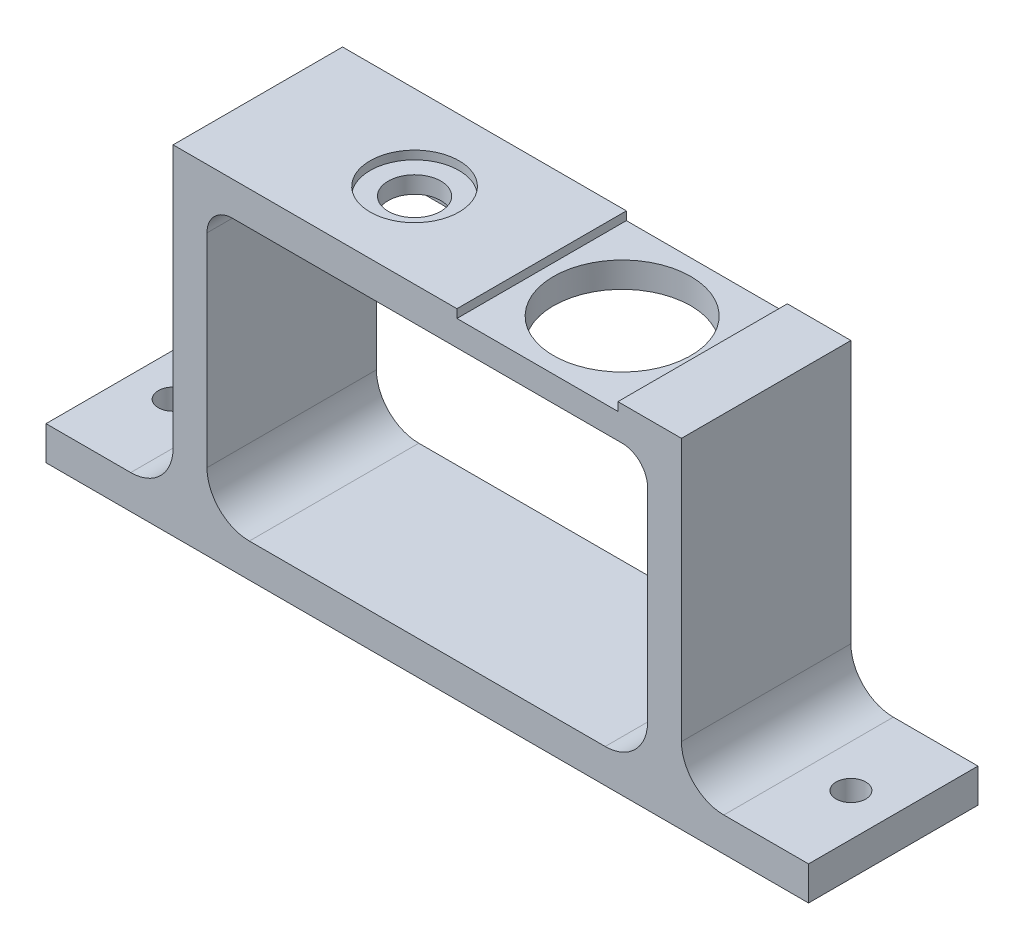
ISO-10303-21;
HEADER;
FILE_DESCRIPTION(('STEP AP214'),'2;1');
FILE_NAME('part.step','',(''),(''),'','','');
FILE_SCHEMA(('AUTOMOTIVE_DESIGN { 1 0 10303 214 1 1 1 1 }'));
ENDSEC;
DATA;
#1=APPLICATION_CONTEXT('core data for automotive mechanical design processes');
#2=APPLICATION_PROTOCOL_DEFINITION('international standard','automotive_design',2000,#1);
#3=PRODUCT_CONTEXT('',#1,'mechanical');
#4=PRODUCT('Part','Part','',(#3));
#5=PRODUCT_RELATED_PRODUCT_CATEGORY('part','',(#4));
#6=PRODUCT_DEFINITION_FORMATION('','',#4);
#7=PRODUCT_DEFINITION_CONTEXT('part definition',#1,'design');
#8=PRODUCT_DEFINITION('design','',#6,#7);
#9=PRODUCT_DEFINITION_SHAPE('','',#8);
#10=(LENGTH_UNIT() NAMED_UNIT(*) SI_UNIT(.MILLI.,.METRE.));
#11=(NAMED_UNIT(*) PLANE_ANGLE_UNIT() SI_UNIT($,.RADIAN.));
#12=(NAMED_UNIT(*) SI_UNIT($,.STERADIAN.) SOLID_ANGLE_UNIT());
#13=UNCERTAINTY_MEASURE_WITH_UNIT(LENGTH_MEASURE(1.E-05),#10,'distance_accuracy_value','');
#14=(GEOMETRIC_REPRESENTATION_CONTEXT(3) GLOBAL_UNCERTAINTY_ASSIGNED_CONTEXT((#13)) GLOBAL_UNIT_ASSIGNED_CONTEXT((#10,
#11,#12)) REPRESENTATION_CONTEXT('',''));
#15=CARTESIAN_POINT('',(0.,0.,0.));
#16=DIRECTION('',(0.,0.,1.));
#17=DIRECTION('',(1.,0.,0.));
#18=AXIS2_PLACEMENT_3D('',#15,#16,#17);
#19=CARTESIAN_POINT('',(33.5,30.,-10.));
#20=DIRECTION('',(0.,1.,0.));
#21=DIRECTION('',(0.,0.,1.));
#22=AXIS2_PLACEMENT_3D('',#19,#20,#21);
#23=CYLINDRICAL_SURFACE('',#22,3.1);
#24=CARTESIAN_POINT('',(33.5,37.,-10.));
#25=DIRECTION('',(0.,1.,0.));
#26=DIRECTION('',(0.,0.,1.));
#27=AXIS2_PLACEMENT_3D('',#24,#25,#26);
#28=CIRCLE('',#27,3.1);
#29=CARTESIAN_POINT('',(33.5,37.,-6.9));
#30=VERTEX_POINT('',#29);
#31=EDGE_CURVE('E247',#30,#30,#28,.F.);
#32=ORIENTED_EDGE('',*,*,#31,.T.);
#33=EDGE_LOOP('',(#32));
#34=FACE_BOUND('',#33,.T.);
#35=CARTESIAN_POINT('',(33.5,39.,-10.));
#36=DIRECTION('',(0.,1.,0.));
#37=DIRECTION('',(0.,0.,1.));
#38=AXIS2_PLACEMENT_3D('',#35,#36,#37);
#39=CIRCLE('',#38,3.1);
#40=CARTESIAN_POINT('',(33.5,39.,-6.9));
#41=VERTEX_POINT('',#40);
#42=EDGE_CURVE('E38',#41,#41,#39,.F.);
#43=ORIENTED_EDGE('',*,*,#42,.F.);
#44=EDGE_LOOP('',(#43));
#45=FACE_BOUND('',#44,.T.);
#46=ADVANCED_FACE('F34',(#34,#45),#23,.F.);
#47=CARTESIAN_POINT('',(0.,40.,0.));
#48=DIRECTION('',(0.,1.,0.));
#49=DIRECTION('',(0.,0.,1.));
#50=AXIS2_PLACEMENT_3D('',#47,#48,#49);
#51=PLANE('',#50);
#52=DIRECTION('',(0.,0.,-1.));
#53=VECTOR('',#52,1.);
#54=CARTESIAN_POINT('',(67.5,40.,0.));
#55=LINE('',#54,#53);
#56=CARTESIAN_POINT('',(67.5,40.,0.));
#57=VERTEX_POINT('',#56);
#58=CARTESIAN_POINT('',(67.5,40.,-20.));
#59=VERTEX_POINT('',#58);
#60=EDGE_CURVE('E265',#57,#59,#55,.T.);
#61=ORIENTED_EDGE('',*,*,#60,.F.);
#62=DIRECTION('',(1.,0.,0.));
#63=VECTOR('',#62,1.);
#64=CARTESIAN_POINT('',(15.,40.,0.));
#65=LINE('',#64,#63);
#66=CARTESIAN_POINT('',(75.,40.,0.));
#67=VERTEX_POINT('',#66);
#68=EDGE_CURVE('E284',#57,#67,#65,.T.);
#69=ORIENTED_EDGE('',*,*,#68,.T.);
#70=DIRECTION('',(0.,0.,-1.));
#71=VECTOR('',#70,1.);
#72=CARTESIAN_POINT('',(75.,40.,-20.));
#73=LINE('',#72,#71);
#74=CARTESIAN_POINT('',(75.,40.,-20.));
#75=VERTEX_POINT('',#74);
#76=EDGE_CURVE('E289',#67,#75,#73,.T.);
#77=ORIENTED_EDGE('',*,*,#76,.T.);
#78=DIRECTION('',(-1.,0.,0.));
#79=VECTOR('',#78,1.);
#80=CARTESIAN_POINT('',(15.,40.,-20.));
#81=LINE('',#80,#79);
#82=EDGE_CURVE('E293',#75,#59,#81,.T.);
#83=ORIENTED_EDGE('',*,*,#82,.T.);
#84=EDGE_LOOP('',(#61,#69,#77,#83));
#85=FACE_BOUND('',#84,.T.);
#86=ADVANCED_FACE('F441',(#85),#51,.T.);
#87=CARTESIAN_POINT('',(0.,4.,0.));
#88=DIRECTION('',(0.,-1.,0.));
#89=DIRECTION('',(0.,0.,-1.));
#90=AXIS2_PLACEMENT_3D('',#87,#88,#89);
#91=PLANE('',#90);
#92=CARTESIAN_POINT('',(85.,4.,-10.));
#93=DIRECTION('',(0.,1.,0.));
#94=DIRECTION('',(0.,0.,1.));
#95=AXIS2_PLACEMENT_3D('',#92,#93,#94);
#96=CIRCLE('',#95,1.75);
#97=CARTESIAN_POINT('',(85.,4.,-8.25000000000001));
#98=VERTEX_POINT('',#97);
#99=EDGE_CURVE('E327',#98,#98,#96,.T.);
#100=ORIENTED_EDGE('',*,*,#99,.F.);
#101=EDGE_LOOP('',(#100));
#102=FACE_BOUND('',#101,.T.);
#103=DIRECTION('',(-1.,0.,0.));
#104=VECTOR('',#103,1.);
#105=CARTESIAN_POINT('',(0.,4.,-20.));
#106=LINE('',#105,#104);
#107=CARTESIAN_POINT('',(90.,4.,-20.));
#108=VERTEX_POINT('',#107);
#109=CARTESIAN_POINT('',(80.,4.,-20.));
#110=VERTEX_POINT('',#109);
#111=EDGE_CURVE('E345',#108,#110,#106,.T.);
#112=ORIENTED_EDGE('',*,*,#111,.T.);
#113=DIRECTION('',(0.,0.,-1.));
#114=VECTOR('',#113,1.);
#115=CARTESIAN_POINT('',(80.,4.,0.));
#116=LINE('',#115,#114);
#117=CARTESIAN_POINT('',(80.,4.,0.));
#118=VERTEX_POINT('',#117);
#119=EDGE_CURVE('E371',#110,#118,#116,.F.);
#120=ORIENTED_EDGE('',*,*,#119,.T.);
#121=DIRECTION('',(1.,0.,0.));
#122=VECTOR('',#121,1.);
#123=CARTESIAN_POINT('',(0.,4.,0.));
#124=LINE('',#123,#122);
#125=CARTESIAN_POINT('',(90.,4.,0.));
#126=VERTEX_POINT('',#125);
#127=EDGE_CURVE('E336',#118,#126,#124,.T.);
#128=ORIENTED_EDGE('',*,*,#127,.T.);
#129=DIRECTION('',(0.,0.,-1.));
#130=VECTOR('',#129,1.);
#131=CARTESIAN_POINT('',(90.,4.,0.));
#132=LINE('',#131,#130);
#133=EDGE_CURVE('E341',#126,#108,#132,.T.);
#134=ORIENTED_EDGE('',*,*,#133,.T.);
#135=EDGE_LOOP('',(#112,#120,#128,#134));
#136=FACE_BOUND('',#135,.T.);
#137=ADVANCED_FACE('F446',(#102,#136),#91,.F.);
#138=CARTESIAN_POINT('',(24.,4.,0.));
#139=VERTEX_POINT('',#138);
#140=CARTESIAN_POINT('',(66.,4.,0.));
#141=VERTEX_POINT('',#140);
#142=EDGE_CURVE('E342',#139,#141,#124,.T.);
#143=ORIENTED_EDGE('',*,*,#142,.T.);
#144=DIRECTION('',(0.,0.,1.));
#145=VECTOR('',#144,1.);
#146=CARTESIAN_POINT('',(66.,4.,-20.));
#147=LINE('',#146,#145);
#148=CARTESIAN_POINT('',(66.,4.,-20.));
#149=VERTEX_POINT('',#148);
#150=EDGE_CURVE('E378',#141,#149,#147,.F.);
#151=ORIENTED_EDGE('',*,*,#150,.T.);
#152=CARTESIAN_POINT('',(24.,4.,-20.));
#153=VERTEX_POINT('',#152);
#154=EDGE_CURVE('E349',#149,#153,#106,.T.);
#155=ORIENTED_EDGE('',*,*,#154,.T.);
#156=DIRECTION('',(0.,0.,-1.));
#157=VECTOR('',#156,1.);
#158=CARTESIAN_POINT('',(24.,4.,0.));
#159=LINE('',#158,#157);
#160=EDGE_CURVE('E376',#153,#139,#159,.F.);
#161=ORIENTED_EDGE('',*,*,#160,.T.);
#162=EDGE_LOOP('',(#143,#151,#155,#161));
#163=FACE_BOUND('',#162,.T.);
#164=ADVANCED_FACE('F498',(#163),#91,.F.);
#165=CARTESIAN_POINT('',(4.99999999999999,4.,-10.));
#166=DIRECTION('',(0.,1.,0.));
#167=DIRECTION('',(0.,0.,-1.));
#168=AXIS2_PLACEMENT_3D('',#165,#166,#167);
#169=CIRCLE('',#168,1.75);
#170=CARTESIAN_POINT('',(4.99999999999999,4.,-11.75));
#171=VERTEX_POINT('',#170);
#172=EDGE_CURVE('E321',#171,#171,#169,.T.);
#173=ORIENTED_EDGE('',*,*,#172,.F.);
#174=EDGE_LOOP('',(#173));
#175=FACE_BOUND('',#174,.T.);
#176=CARTESIAN_POINT('',(0.,4.,0.));
#177=VERTEX_POINT('',#176);
#178=CARTESIAN_POINT('',(9.99999999999998,4.,0.));
#179=VERTEX_POINT('',#178);
#180=EDGE_CURVE('E338',#177,#179,#124,.T.);
#181=ORIENTED_EDGE('',*,*,#180,.T.);
#182=DIRECTION('',(0.,0.,1.));
#183=VECTOR('',#182,1.);
#184=CARTESIAN_POINT('',(9.99999999999998,4.,-20.));
#185=LINE('',#184,#183);
#186=CARTESIAN_POINT('',(9.99999999999998,4.,-20.));
#187=VERTEX_POINT('',#186);
#188=EDGE_CURVE('E383',#179,#187,#185,.F.);
#189=ORIENTED_EDGE('',*,*,#188,.T.);
#190=CARTESIAN_POINT('',(0.,4.,-20.));
#191=VERTEX_POINT('',#190);
#192=EDGE_CURVE('E344',#187,#191,#106,.T.);
#193=ORIENTED_EDGE('',*,*,#192,.T.);
#194=DIRECTION('',(0.,0.,1.));
#195=VECTOR('',#194,1.);
#196=CARTESIAN_POINT('',(0.,4.,0.));
#197=LINE('',#196,#195);
#198=EDGE_CURVE('E333',#191,#177,#197,.T.);
#199=ORIENTED_EDGE('',*,*,#198,.T.);
#200=EDGE_LOOP('',(#181,#189,#193,#199));
#201=FACE_BOUND('',#200,.T.);
#202=ADVANCED_FACE('F494',(#175,#201),#91,.F.);
#203=CARTESIAN_POINT('',(0.,0.,0.));
#204=DIRECTION('',(0.,-1.,0.));
#205=DIRECTION('',(0.,0.,-1.));
#206=AXIS2_PLACEMENT_3D('',#203,#204,#205);
#207=PLANE('',#206);
#208=CARTESIAN_POINT('',(85.,0.,-10.));
#209=DIRECTION('',(0.,1.,0.));
#210=DIRECTION('',(0.,0.,1.));
#211=AXIS2_PLACEMENT_3D('',#208,#209,#210);
#212=CIRCLE('',#211,1.75);
#213=CARTESIAN_POINT('',(85.,0.,-8.25000000000001));
#214=VERTEX_POINT('',#213);
#215=EDGE_CURVE('E324',#214,#214,#212,.T.);
#216=ORIENTED_EDGE('',*,*,#215,.T.);
#217=EDGE_LOOP('',(#216));
#218=FACE_BOUND('',#217,.T.);
#219=DIRECTION('',(0.,0.,1.));
#220=VECTOR('',#219,1.);
#221=CARTESIAN_POINT('',(0.,0.,0.));
#222=LINE('',#221,#220);
#223=CARTESIAN_POINT('',(0.,0.,-20.));
#224=VERTEX_POINT('',#223);
#225=CARTESIAN_POINT('',(0.,0.,0.));
#226=VERTEX_POINT('',#225);
#227=EDGE_CURVE('E330',#224,#226,#222,.T.);
#228=ORIENTED_EDGE('',*,*,#227,.F.);
#229=DIRECTION('',(-1.,0.,0.));
#230=VECTOR('',#229,1.);
#231=CARTESIAN_POINT('',(0.,0.,-20.));
#232=LINE('',#231,#230);
#233=CARTESIAN_POINT('',(90.,0.,-20.));
#234=VERTEX_POINT('',#233);
#235=EDGE_CURVE('E337',#234,#224,#232,.T.);
#236=ORIENTED_EDGE('',*,*,#235,.F.);
#237=DIRECTION('',(0.,0.,-1.));
#238=VECTOR('',#237,1.);
#239=CARTESIAN_POINT('',(90.,0.,0.));
#240=LINE('',#239,#238);
#241=CARTESIAN_POINT('',(90.,0.,0.));
#242=VERTEX_POINT('',#241);
#243=EDGE_CURVE('E354',#242,#234,#240,.T.);
#244=ORIENTED_EDGE('',*,*,#243,.F.);
#245=DIRECTION('',(1.,0.,0.));
#246=VECTOR('',#245,1.);
#247=CARTESIAN_POINT('',(0.,0.,0.));
#248=LINE('',#247,#246);
#249=EDGE_CURVE('E352',#226,#242,#248,.T.);
#250=ORIENTED_EDGE('',*,*,#249,.F.);
#251=EDGE_LOOP('',(#228,#236,#244,#250));
#252=FACE_BOUND('',#251,.T.);
#253=CARTESIAN_POINT('',(4.99999999999999,0.,-10.));
#254=DIRECTION('',(0.,1.,0.));
#255=DIRECTION('',(0.,0.,-1.));
#256=AXIS2_PLACEMENT_3D('',#253,#254,#255);
#257=CIRCLE('',#256,1.75);
#258=CARTESIAN_POINT('',(4.99999999999999,0.,-11.75));
#259=VERTEX_POINT('',#258);
#260=EDGE_CURVE('E320',#259,#259,#257,.T.);
#261=ORIENTED_EDGE('',*,*,#260,.T.);
#262=EDGE_LOOP('',(#261));
#263=FACE_BOUND('',#262,.T.);
#264=ADVANCED_FACE('F497',(#218,#252,#263),#207,.T.);
#265=CARTESIAN_POINT('',(0.,4.,0.));
#266=DIRECTION('',(1.,0.,0.));
#267=DIRECTION('',(0.,0.,-1.));
#268=AXIS2_PLACEMENT_3D('',#265,#266,#267);
#269=PLANE('',#268);
#270=ORIENTED_EDGE('',*,*,#227,.T.);
#271=DIRECTION('',(0.,-1.,0.));
#272=VECTOR('',#271,1.);
#273=CARTESIAN_POINT('',(0.,4.,0.));
#274=LINE('',#273,#272);
#275=EDGE_CURVE('E365',#177,#226,#274,.T.);
#276=ORIENTED_EDGE('',*,*,#275,.F.);
#277=ORIENTED_EDGE('',*,*,#198,.F.);
#278=DIRECTION('',(0.,-1.,0.));
#279=VECTOR('',#278,1.);
#280=CARTESIAN_POINT('',(0.,4.,-20.));
#281=LINE('',#280,#279);
#282=EDGE_CURVE('E348',#191,#224,#281,.T.);
#283=ORIENTED_EDGE('',*,*,#282,.T.);
#284=EDGE_LOOP('',(#270,#276,#277,#283));
#285=FACE_BOUND('',#284,.T.);
#286=ADVANCED_FACE('F502',(#285),#269,.F.);
#287=CARTESIAN_POINT('',(0.,4.,0.));
#288=DIRECTION('',(0.,0.,-1.));
#289=DIRECTION('',(-1.,0.,0.));
#290=AXIS2_PLACEMENT_3D('',#287,#288,#289);
#291=PLANE('',#290);
#292=ORIENTED_EDGE('',*,*,#68,.F.);
#293=DIRECTION('',(0.,1.,0.));
#294=VECTOR('',#293,1.);
#295=CARTESIAN_POINT('',(67.5,39.,0.));
#296=LINE('',#295,#294);
#297=CARTESIAN_POINT('',(67.5,39.,0.));
#298=VERTEX_POINT('',#297);
#299=EDGE_CURVE('E268',#298,#57,#296,.T.);
#300=ORIENTED_EDGE('',*,*,#299,.F.);
#301=DIRECTION('',(1.,0.,0.));
#302=VECTOR('',#301,1.);
#303=CARTESIAN_POINT('',(48.5,39.,0.));
#304=LINE('',#303,#302);
#305=CARTESIAN_POINT('',(48.5,39.,0.));
#306=VERTEX_POINT('',#305);
#307=EDGE_CURVE('E261',#306,#298,#304,.T.);
#308=ORIENTED_EDGE('',*,*,#307,.F.);
#309=DIRECTION('',(0.,1.,0.));
#310=VECTOR('',#309,1.);
#311=CARTESIAN_POINT('',(48.5,39.,0.));
#312=LINE('',#311,#310);
#313=CARTESIAN_POINT('',(48.5,40.,0.));
#314=VERTEX_POINT('',#313);
#315=EDGE_CURVE('E271',#306,#314,#312,.T.);
#316=ORIENTED_EDGE('',*,*,#315,.T.);
#317=CARTESIAN_POINT('',(15.,40.,0.));
#318=VERTEX_POINT('',#317);
#319=EDGE_CURVE('E286',#318,#314,#65,.T.);
#320=ORIENTED_EDGE('',*,*,#319,.F.);
#321=DIRECTION('',(0.,-1.,0.));
#322=VECTOR('',#321,1.);
#323=CARTESIAN_POINT('',(15.,36.,0.));
#324=LINE('',#323,#322);
#325=CARTESIAN_POINT('',(15.,9.,0.));
#326=VERTEX_POINT('',#325);
#327=EDGE_CURVE('E317',#318,#326,#324,.T.);
#328=ORIENTED_EDGE('',*,*,#327,.T.);
#329=CARTESIAN_POINT('',(9.99999999999999,9.,0.));
#330=DIRECTION('',(0.,0.,-1.));
#331=DIRECTION('',(-1.,0.,0.));
#332=AXIS2_PLACEMENT_3D('',#329,#330,#331);
#333=CIRCLE('',#332,5.);
#334=EDGE_CURVE('E397',#326,#179,#333,.T.);
#335=ORIENTED_EDGE('',*,*,#334,.T.);
#336=ORIENTED_EDGE('',*,*,#180,.F.);
#337=ORIENTED_EDGE('',*,*,#275,.T.);
#338=ORIENTED_EDGE('',*,*,#249,.T.);
#339=DIRECTION('',(0.,-1.,0.));
#340=VECTOR('',#339,1.);
#341=CARTESIAN_POINT('',(90.,4.,0.));
#342=LINE('',#341,#340);
#343=EDGE_CURVE('E362',#126,#242,#342,.T.);
#344=ORIENTED_EDGE('',*,*,#343,.F.);
#345=ORIENTED_EDGE('',*,*,#127,.F.);
#346=CARTESIAN_POINT('',(80.,9.,0.));
#347=DIRECTION('',(0.,0.,-1.));
#348=DIRECTION('',(-1.,0.,0.));
#349=AXIS2_PLACEMENT_3D('',#346,#347,#348);
#350=CIRCLE('',#349,5.);
#351=CARTESIAN_POINT('',(75.,9.,0.));
#352=VERTEX_POINT('',#351);
#353=EDGE_CURVE('E390',#118,#352,#350,.T.);
#354=ORIENTED_EDGE('',*,*,#353,.T.);
#355=DIRECTION('',(0.,-1.,0.));
#356=VECTOR('',#355,1.);
#357=CARTESIAN_POINT('',(75.,36.,0.));
#358=LINE('',#357,#356);
#359=EDGE_CURVE('E307',#67,#352,#358,.T.);
#360=ORIENTED_EDGE('',*,*,#359,.F.);
#361=EDGE_LOOP('',(#292,#300,#308,#316,#320,#328,#335,#336,#337,#338,#344,#345,#354,#360));
#362=FACE_BOUND('',#361,.T.);
#363=DIRECTION('',(0.,-1.,0.));
#364=VECTOR('',#363,1.);
#365=CARTESIAN_POINT('',(19.,36.,0.));
#366=LINE('',#365,#364);
#367=CARTESIAN_POINT('',(19.,33.,0.));
#368=VERTEX_POINT('',#367);
#369=CARTESIAN_POINT('',(19.,9.,0.));
#370=VERTEX_POINT('',#369);
#371=EDGE_CURVE('E315',#368,#370,#366,.T.);
#372=ORIENTED_EDGE('',*,*,#371,.F.);
#373=CARTESIAN_POINT('',(22.,33.,0.));
#374=DIRECTION('',(0.,0.,-1.));
#375=DIRECTION('',(-1.,0.,0.));
#376=AXIS2_PLACEMENT_3D('',#373,#374,#375);
#377=CIRCLE('',#376,3.);
#378=CARTESIAN_POINT('',(22.,36.,0.));
#379=VERTEX_POINT('',#378);
#380=EDGE_CURVE('E11',#368,#379,#377,.T.);
#381=ORIENTED_EDGE('',*,*,#380,.T.);
#382=DIRECTION('',(1.,0.,0.));
#383=VECTOR('',#382,1.);
#384=CARTESIAN_POINT('',(15.,36.,0.));
#385=LINE('',#384,#383);
#386=CARTESIAN_POINT('',(68.,36.,0.));
#387=VERTEX_POINT('',#386);
#388=EDGE_CURVE('E280',#379,#387,#385,.T.);
#389=ORIENTED_EDGE('',*,*,#388,.T.);
#390=CARTESIAN_POINT('',(68.,33.,0.));
#391=DIRECTION('',(0.,0.,-1.));
#392=DIRECTION('',(-1.,0.,0.));
#393=AXIS2_PLACEMENT_3D('',#390,#391,#392);
#394=CIRCLE('',#393,3.);
#395=CARTESIAN_POINT('',(71.,33.,0.));
#396=VERTEX_POINT('',#395);
#397=EDGE_CURVE('E416',#387,#396,#394,.T.);
#398=ORIENTED_EDGE('',*,*,#397,.T.);
#399=DIRECTION('',(0.,-1.,0.));
#400=VECTOR('',#399,1.);
#401=CARTESIAN_POINT('',(71.,36.,0.));
#402=LINE('',#401,#400);
#403=CARTESIAN_POINT('',(71.,9.,0.));
#404=VERTEX_POINT('',#403);
#405=EDGE_CURVE('E296',#396,#404,#402,.T.);
#406=ORIENTED_EDGE('',*,*,#405,.T.);
#407=CARTESIAN_POINT('',(66.,9.,0.));
#408=DIRECTION('',(0.,0.,-1.));
#409=DIRECTION('',(-1.,0.,0.));
#410=AXIS2_PLACEMENT_3D('',#407,#408,#409);
#411=CIRCLE('',#410,5.);
#412=EDGE_CURVE('E392',#404,#141,#411,.T.);
#413=ORIENTED_EDGE('',*,*,#412,.T.);
#414=ORIENTED_EDGE('',*,*,#142,.F.);
#415=CARTESIAN_POINT('',(24.,9.,0.));
#416=DIRECTION('',(0.,0.,-1.));
#417=DIRECTION('',(-1.,0.,0.));
#418=AXIS2_PLACEMENT_3D('',#415,#416,#417);
#419=CIRCLE('',#418,5.);
#420=EDGE_CURVE('E403',#139,#370,#419,.T.);
#421=ORIENTED_EDGE('',*,*,#420,.T.);
#422=EDGE_LOOP('',(#372,#381,#389,#398,#406,#413,#414,#421));
#423=FACE_BOUND('',#422,.T.);
#424=ADVANCED_FACE('F510',(#362,#423),#291,.F.);
#425=CARTESIAN_POINT('',(90.,4.,0.));
#426=DIRECTION('',(-1.,0.,0.));
#427=DIRECTION('',(0.,0.,1.));
#428=AXIS2_PLACEMENT_3D('',#425,#426,#427);
#429=PLANE('',#428);
#430=ORIENTED_EDGE('',*,*,#243,.T.);
#431=DIRECTION('',(0.,-1.,0.));
#432=VECTOR('',#431,1.);
#433=CARTESIAN_POINT('',(90.,4.,-20.));
#434=LINE('',#433,#432);
#435=EDGE_CURVE('E359',#108,#234,#434,.T.);
#436=ORIENTED_EDGE('',*,*,#435,.F.);
#437=ORIENTED_EDGE('',*,*,#133,.F.);
#438=ORIENTED_EDGE('',*,*,#343,.T.);
#439=EDGE_LOOP('',(#430,#436,#437,#438));
#440=FACE_BOUND('',#439,.T.);
#441=ADVANCED_FACE('F506',(#440),#429,.F.);
#442=CARTESIAN_POINT('',(0.,4.,-20.));
#443=DIRECTION('',(0.,0.,1.));
#444=DIRECTION('',(1.,0.,0.));
#445=AXIS2_PLACEMENT_3D('',#442,#443,#444);
#446=PLANE('',#445);
#447=DIRECTION('',(-1.,0.,0.));
#448=VECTOR('',#447,1.);
#449=CARTESIAN_POINT('',(48.5,39.,-20.));
#450=LINE('',#449,#448);
#451=CARTESIAN_POINT('',(67.5,39.,-20.));
#452=VERTEX_POINT('',#451);
#453=CARTESIAN_POINT('',(48.5,39.,-20.));
#454=VERTEX_POINT('',#453);
#455=EDGE_CURVE('E254',#452,#454,#450,.T.);
#456=ORIENTED_EDGE('',*,*,#455,.F.);
#457=DIRECTION('',(0.,1.,0.));
#458=VECTOR('',#457,1.);
#459=CARTESIAN_POINT('',(67.5,39.,-20.));
#460=LINE('',#459,#458);
#461=EDGE_CURVE('E264',#452,#59,#460,.T.);
#462=ORIENTED_EDGE('',*,*,#461,.T.);
#463=ORIENTED_EDGE('',*,*,#82,.F.);
#464=DIRECTION('',(0.,-1.,0.));
#465=VECTOR('',#464,1.);
#466=CARTESIAN_POINT('',(75.,36.,-20.));
#467=LINE('',#466,#465);
#468=CARTESIAN_POINT('',(75.,9.,-20.));
#469=VERTEX_POINT('',#468);
#470=EDGE_CURVE('E304',#75,#469,#467,.T.);
#471=ORIENTED_EDGE('',*,*,#470,.T.);
#472=CARTESIAN_POINT('',(80.,9.,-20.));
#473=DIRECTION('',(0.,0.,1.));
#474=DIRECTION('',(1.,0.,0.));
#475=AXIS2_PLACEMENT_3D('',#472,#473,#474);
#476=CIRCLE('',#475,5.);
#477=EDGE_CURVE('E388',#469,#110,#476,.T.);
#478=ORIENTED_EDGE('',*,*,#477,.T.);
#479=ORIENTED_EDGE('',*,*,#111,.F.);
#480=ORIENTED_EDGE('',*,*,#435,.T.);
#481=ORIENTED_EDGE('',*,*,#235,.T.);
#482=ORIENTED_EDGE('',*,*,#282,.F.);
#483=ORIENTED_EDGE('',*,*,#192,.F.);
#484=CARTESIAN_POINT('',(9.99999999999998,9.,-20.));
#485=DIRECTION('',(0.,0.,1.));
#486=DIRECTION('',(1.,0.,0.));
#487=AXIS2_PLACEMENT_3D('',#484,#485,#486);
#488=CIRCLE('',#487,5.);
#489=CARTESIAN_POINT('',(15.,9.,-20.));
#490=VERTEX_POINT('',#489);
#491=EDGE_CURVE('E399',#187,#490,#488,.T.);
#492=ORIENTED_EDGE('',*,*,#491,.T.);
#493=DIRECTION('',(0.,-1.,0.));
#494=VECTOR('',#493,1.);
#495=CARTESIAN_POINT('',(15.,36.,-20.));
#496=LINE('',#495,#494);
#497=CARTESIAN_POINT('',(15.,40.,-20.));
#498=VERTEX_POINT('',#497);
#499=EDGE_CURVE('E310',#498,#490,#496,.T.);
#500=ORIENTED_EDGE('',*,*,#499,.F.);
#501=CARTESIAN_POINT('',(48.5,40.,-20.));
#502=VERTEX_POINT('',#501);
#503=EDGE_CURVE('E292',#502,#498,#81,.T.);
#504=ORIENTED_EDGE('',*,*,#503,.F.);
#505=DIRECTION('',(0.,1.,0.));
#506=VECTOR('',#505,1.);
#507=CARTESIAN_POINT('',(48.5,39.,-20.));
#508=LINE('',#507,#506);
#509=EDGE_CURVE('E59',#454,#502,#508,.T.);
#510=ORIENTED_EDGE('',*,*,#509,.F.);
#511=EDGE_LOOP('',(#456,#462,#463,#471,#478,#479,#480,#481,#482,#483,#492,#500,#504,#510));
#512=FACE_BOUND('',#511,.T.);
#513=DIRECTION('',(0.,-1.,0.));
#514=VECTOR('',#513,1.);
#515=CARTESIAN_POINT('',(71.,36.,-20.));
#516=LINE('',#515,#514);
#517=CARTESIAN_POINT('',(71.,33.,-20.));
#518=VERTEX_POINT('',#517);
#519=CARTESIAN_POINT('',(71.,9.,-20.));
#520=VERTEX_POINT('',#519);
#521=EDGE_CURVE('E302',#518,#520,#516,.T.);
#522=ORIENTED_EDGE('',*,*,#521,.F.);
#523=CARTESIAN_POINT('',(68.,33.,-20.));
#524=DIRECTION('',(0.,0.,1.));
#525=DIRECTION('',(1.,0.,0.));
#526=AXIS2_PLACEMENT_3D('',#523,#524,#525);
#527=CIRCLE('',#526,3.);
#528=CARTESIAN_POINT('',(68.,36.,-20.));
#529=VERTEX_POINT('',#528);
#530=EDGE_CURVE('E418',#518,#529,#527,.T.);
#531=ORIENTED_EDGE('',*,*,#530,.T.);
#532=DIRECTION('',(-1.,0.,0.));
#533=VECTOR('',#532,1.);
#534=CARTESIAN_POINT('',(15.,36.,-20.));
#535=LINE('',#534,#533);
#536=CARTESIAN_POINT('',(22.,36.,-20.));
#537=VERTEX_POINT('',#536);
#538=EDGE_CURVE('E285',#529,#537,#535,.T.);
#539=ORIENTED_EDGE('',*,*,#538,.T.);
#540=CARTESIAN_POINT('',(22.,33.,-20.));
#541=DIRECTION('',(0.,0.,1.));
#542=DIRECTION('',(1.,0.,0.));
#543=AXIS2_PLACEMENT_3D('',#540,#541,#542);
#544=CIRCLE('',#543,3.);
#545=CARTESIAN_POINT('',(19.,33.,-20.));
#546=VERTEX_POINT('',#545);
#547=EDGE_CURVE('E43',#537,#546,#544,.T.);
#548=ORIENTED_EDGE('',*,*,#547,.T.);
#549=DIRECTION('',(0.,-1.,0.));
#550=VECTOR('',#549,1.);
#551=CARTESIAN_POINT('',(19.,36.,-20.));
#552=LINE('',#551,#550);
#553=CARTESIAN_POINT('',(19.,9.,-20.));
#554=VERTEX_POINT('',#553);
#555=EDGE_CURVE('E313',#546,#554,#552,.T.);
#556=ORIENTED_EDGE('',*,*,#555,.T.);
#557=CARTESIAN_POINT('',(24.,9.,-20.));
#558=DIRECTION('',(0.,0.,1.));
#559=DIRECTION('',(1.,0.,0.));
#560=AXIS2_PLACEMENT_3D('',#557,#558,#559);
#561=CIRCLE('',#560,5.);
#562=EDGE_CURVE('E401',#554,#153,#561,.T.);
#563=ORIENTED_EDGE('',*,*,#562,.T.);
#564=ORIENTED_EDGE('',*,*,#154,.F.);
#565=CARTESIAN_POINT('',(66.,9.,-20.));
#566=DIRECTION('',(0.,0.,1.));
#567=DIRECTION('',(1.,0.,0.));
#568=AXIS2_PLACEMENT_3D('',#565,#566,#567);
#569=CIRCLE('',#568,5.);
#570=EDGE_CURVE('E394',#149,#520,#569,.T.);
#571=ORIENTED_EDGE('',*,*,#570,.T.);
#572=EDGE_LOOP('',(#522,#531,#539,#548,#556,#563,#564,#571));
#573=FACE_BOUND('',#572,.T.);
#574=ADVANCED_FACE('F492',(#512,#573),#446,.F.);
#575=CARTESIAN_POINT('',(85.,4.,-10.));
#576=DIRECTION('',(0.,-1.,0.));
#577=DIRECTION('',(0.,0.,-1.));
#578=AXIS2_PLACEMENT_3D('',#575,#576,#577);
#579=CYLINDRICAL_SURFACE('',#578,1.75);
#580=ORIENTED_EDGE('',*,*,#99,.T.);
#581=EDGE_LOOP('',(#580));
#582=FACE_BOUND('',#581,.T.);
#583=ORIENTED_EDGE('',*,*,#215,.F.);
#584=EDGE_LOOP('',(#583));
#585=FACE_BOUND('',#584,.T.);
#586=ADVANCED_FACE('F488',(#582,#585),#579,.F.);
#587=CARTESIAN_POINT('',(4.99999999999999,4.,-10.));
#588=DIRECTION('',(0.,-1.,0.));
#589=DIRECTION('',(0.,0.,-1.));
#590=AXIS2_PLACEMENT_3D('',#587,#588,#589);
#591=CYLINDRICAL_SURFACE('',#590,1.75);
#592=ORIENTED_EDGE('',*,*,#172,.T.);
#593=EDGE_LOOP('',(#592));
#594=FACE_BOUND('',#593,.T.);
#595=ORIENTED_EDGE('',*,*,#260,.F.);
#596=EDGE_LOOP('',(#595));
#597=FACE_BOUND('',#596,.T.);
#598=ADVANCED_FACE('F484',(#594,#597),#591,.F.);
#599=CARTESIAN_POINT('',(15.,36.,-20.));
#600=DIRECTION('',(1.,0.,0.));
#601=DIRECTION('',(0.,0.,-1.));
#602=AXIS2_PLACEMENT_3D('',#599,#600,#601);
#603=PLANE('',#602);
#604=ORIENTED_EDGE('',*,*,#499,.T.);
#605=DIRECTION('',(0.,0.,1.));
#606=VECTOR('',#605,1.);
#607=CARTESIAN_POINT('',(15.,9.,0.));
#608=LINE('',#607,#606);
#609=EDGE_CURVE('E380',#490,#326,#608,.T.);
#610=ORIENTED_EDGE('',*,*,#609,.T.);
#611=ORIENTED_EDGE('',*,*,#327,.F.);
#612=DIRECTION('',(0.,0.,1.));
#613=VECTOR('',#612,1.);
#614=CARTESIAN_POINT('',(15.,40.,-20.));
#615=LINE('',#614,#613);
#616=EDGE_CURVE('E281',#498,#318,#615,.T.);
#617=ORIENTED_EDGE('',*,*,#616,.F.);
#618=EDGE_LOOP('',(#604,#610,#611,#617));
#619=FACE_BOUND('',#618,.T.);
#620=ADVANCED_FACE('F480',(#619),#603,.F.);
#621=CARTESIAN_POINT('',(19.,36.,-20.));
#622=DIRECTION('',(-1.,0.,0.));
#623=DIRECTION('',(0.,0.,1.));
#624=AXIS2_PLACEMENT_3D('',#621,#622,#623);
#625=PLANE('',#624);
#626=ORIENTED_EDGE('',*,*,#555,.F.);
#627=DIRECTION('',(0.,0.,-1.));
#628=VECTOR('',#627,1.);
#629=CARTESIAN_POINT('',(19.,33.,0.));
#630=LINE('',#629,#628);
#631=EDGE_CURVE('E414',#546,#368,#630,.F.);
#632=ORIENTED_EDGE('',*,*,#631,.T.);
#633=ORIENTED_EDGE('',*,*,#371,.T.);
#634=DIRECTION('',(0.,0.,-1.));
#635=VECTOR('',#634,1.);
#636=CARTESIAN_POINT('',(19.,9.,-20.));
#637=LINE('',#636,#635);
#638=EDGE_CURVE('E385',#370,#554,#637,.T.);
#639=ORIENTED_EDGE('',*,*,#638,.T.);
#640=EDGE_LOOP('',(#626,#632,#633,#639));
#641=FACE_BOUND('',#640,.T.);
#642=ADVANCED_FACE('F476',(#641),#625,.F.);
#643=CARTESIAN_POINT('',(75.,36.,-20.));
#644=DIRECTION('',(-1.,0.,0.));
#645=DIRECTION('',(0.,0.,1.));
#646=AXIS2_PLACEMENT_3D('',#643,#644,#645);
#647=PLANE('',#646);
#648=ORIENTED_EDGE('',*,*,#359,.T.);
#649=DIRECTION('',(0.,0.,-1.));
#650=VECTOR('',#649,1.);
#651=CARTESIAN_POINT('',(75.,9.,-20.));
#652=LINE('',#651,#650);
#653=EDGE_CURVE('E368',#352,#469,#652,.T.);
#654=ORIENTED_EDGE('',*,*,#653,.T.);
#655=ORIENTED_EDGE('',*,*,#470,.F.);
#656=ORIENTED_EDGE('',*,*,#76,.F.);
#657=EDGE_LOOP('',(#648,#654,#655,#656));
#658=FACE_BOUND('',#657,.T.);
#659=ADVANCED_FACE('F472',(#658),#647,.F.);
#660=CARTESIAN_POINT('',(71.,36.,0.));
#661=DIRECTION('',(1.,0.,0.));
#662=DIRECTION('',(0.,0.,-1.));
#663=AXIS2_PLACEMENT_3D('',#660,#661,#662);
#664=PLANE('',#663);
#665=ORIENTED_EDGE('',*,*,#405,.F.);
#666=DIRECTION('',(0.,0.,1.));
#667=VECTOR('',#666,1.);
#668=CARTESIAN_POINT('',(71.,33.,-20.));
#669=LINE('',#668,#667);
#670=EDGE_CURVE('E412',#396,#518,#669,.F.);
#671=ORIENTED_EDGE('',*,*,#670,.T.);
#672=ORIENTED_EDGE('',*,*,#521,.T.);
#673=DIRECTION('',(0.,0.,1.));
#674=VECTOR('',#673,1.);
#675=CARTESIAN_POINT('',(71.,9.,0.));
#676=LINE('',#675,#674);
#677=EDGE_CURVE('E373',#520,#404,#676,.T.);
#678=ORIENTED_EDGE('',*,*,#677,.T.);
#679=EDGE_LOOP('',(#665,#671,#672,#678));
#680=FACE_BOUND('',#679,.T.);
#681=ADVANCED_FACE('F468',(#680),#664,.F.);
#682=CARTESIAN_POINT('',(0.,36.,0.));
#683=DIRECTION('',(0.,1.,0.));
#684=DIRECTION('',(0.,0.,1.));
#685=AXIS2_PLACEMENT_3D('',#682,#683,#684);
#686=PLANE('',#685);
#687=DIRECTION('',(-1.,0.,0.));
#688=VECTOR('',#687,1.);
#689=CARTESIAN_POINT('',(26.7,36.,-6.25));
#690=LINE('',#689,#688);
#691=CARTESIAN_POINT('',(40.3,36.,-6.25));
#692=VERTEX_POINT('',#691);
#693=CARTESIAN_POINT('',(26.7,36.,-6.25));
#694=VERTEX_POINT('',#693);
#695=EDGE_CURVE('E241',#692,#694,#690,.T.);
#696=ORIENTED_EDGE('',*,*,#695,.F.);
#697=DIRECTION('',(0.,0.,1.));
#698=VECTOR('',#697,1.);
#699=CARTESIAN_POINT('',(40.3,36.,-13.75));
#700=LINE('',#699,#698);
#701=CARTESIAN_POINT('',(40.3,36.,-13.75));
#702=VERTEX_POINT('',#701);
#703=EDGE_CURVE('E51',#702,#692,#700,.T.);
#704=ORIENTED_EDGE('',*,*,#703,.F.);
#705=DIRECTION('',(1.,0.,0.));
#706=VECTOR('',#705,1.);
#707=CARTESIAN_POINT('',(26.7,36.,-13.75));
#708=LINE('',#707,#706);
#709=CARTESIAN_POINT('',(26.7,36.,-13.75));
#710=VERTEX_POINT('',#709);
#711=EDGE_CURVE('E229',#710,#702,#708,.T.);
#712=ORIENTED_EDGE('',*,*,#711,.F.);
#713=DIRECTION('',(0.,0.,-1.));
#714=VECTOR('',#713,1.);
#715=CARTESIAN_POINT('',(26.7,36.,-13.75));
#716=LINE('',#715,#714);
#717=EDGE_CURVE('E232',#694,#710,#716,.T.);
#718=ORIENTED_EDGE('',*,*,#717,.F.);
#719=EDGE_LOOP('',(#696,#704,#712,#718));
#720=FACE_BOUND('',#719,.T.);
#721=CARTESIAN_POINT('',(58.,36.,-10.));
#722=DIRECTION('',(0.,1.,0.));
#723=DIRECTION('',(0.,0.,1.));
#724=AXIS2_PLACEMENT_3D('',#721,#722,#723);
#725=CIRCLE('',#724,8.09999999999999);
#726=CARTESIAN_POINT('',(58.,36.,-1.90000000000001));
#727=VERTEX_POINT('',#726);
#728=EDGE_CURVE('E277',#727,#727,#725,.T.);
#729=ORIENTED_EDGE('',*,*,#728,.T.);
#730=EDGE_LOOP('',(#729));
#731=FACE_BOUND('',#730,.T.);
#732=ORIENTED_EDGE('',*,*,#538,.F.);
#733=DIRECTION('',(0.,0.,1.));
#734=VECTOR('',#733,1.);
#735=CARTESIAN_POINT('',(68.,36.,0.));
#736=LINE('',#735,#734);
#737=EDGE_CURVE('E409',#529,#387,#736,.T.);
#738=ORIENTED_EDGE('',*,*,#737,.T.);
#739=ORIENTED_EDGE('',*,*,#388,.F.);
#740=DIRECTION('',(0.,0.,-1.));
#741=VECTOR('',#740,1.);
#742=CARTESIAN_POINT('',(22.,36.,-20.));
#743=LINE('',#742,#741);
#744=EDGE_CURVE('E406',#379,#537,#743,.T.);
#745=ORIENTED_EDGE('',*,*,#744,.T.);
#746=EDGE_LOOP('',(#732,#738,#739,#745));
#747=FACE_BOUND('',#746,.T.);
#748=ADVANCED_FACE('F464',(#720,#731,#747),#686,.F.);
#749=CARTESIAN_POINT('',(33.5,40.,-10.));
#750=DIRECTION('',(0.,1.,0.));
#751=DIRECTION('',(0.,0.,1.));
#752=AXIS2_PLACEMENT_3D('',#749,#750,#751);
#753=CIRCLE('',#752,5.25);
#754=CARTESIAN_POINT('',(33.5,40.,-4.75));
#755=VERTEX_POINT('',#754);
#756=EDGE_CURVE('E235',#755,#755,#753,.T.);
#757=ORIENTED_EDGE('',*,*,#756,.F.);
#758=EDGE_LOOP('',(#757));
#759=FACE_BOUND('',#758,.T.);
#760=DIRECTION('',(0.,0.,1.));
#761=VECTOR('',#760,1.);
#762=CARTESIAN_POINT('',(48.5,40.,0.));
#763=LINE('',#762,#761);
#764=EDGE_CURVE('E255',#502,#314,#763,.T.);
#765=ORIENTED_EDGE('',*,*,#764,.F.);
#766=ORIENTED_EDGE('',*,*,#503,.T.);
#767=ORIENTED_EDGE('',*,*,#616,.T.);
#768=ORIENTED_EDGE('',*,*,#319,.T.);
#769=EDGE_LOOP('',(#765,#766,#767,#768));
#770=FACE_BOUND('',#769,.T.);
#771=ADVANCED_FACE('F449',(#759,#770),#51,.T.);
#772=CARTESIAN_POINT('',(58.,40.,-10.));
#773=DIRECTION('',(0.,-1.,0.));
#774=DIRECTION('',(0.,0.,-1.));
#775=AXIS2_PLACEMENT_3D('',#772,#773,#774);
#776=CYLINDRICAL_SURFACE('',#775,8.09999999999999);
#777=CARTESIAN_POINT('',(58.,39.,-10.));
#778=DIRECTION('',(0.,-1.,0.));
#779=DIRECTION('',(0.,0.,-1.));
#780=AXIS2_PLACEMENT_3D('',#777,#778,#779);
#781=CIRCLE('',#780,8.09999999999999);
#782=CARTESIAN_POINT('',(58.,39.,-18.1));
#783=VERTEX_POINT('',#782);
#784=EDGE_CURVE('E270',#783,#783,#781,.T.);
#785=ORIENTED_EDGE('',*,*,#784,.F.);
#786=EDGE_LOOP('',(#785));
#787=FACE_BOUND('',#786,.T.);
#788=ORIENTED_EDGE('',*,*,#728,.F.);
#789=EDGE_LOOP('',(#788));
#790=FACE_BOUND('',#789,.T.);
#791=ADVANCED_FACE('F458',(#787,#790),#776,.F.);
#792=CARTESIAN_POINT('',(80.,9.,-20.));
#793=DIRECTION('',(0.,0.,1.));
#794=DIRECTION('',(1.,0.,0.));
#795=AXIS2_PLACEMENT_3D('',#792,#793,#794);
#796=CYLINDRICAL_SURFACE('',#795,5.);
#797=ORIENTED_EDGE('',*,*,#353,.F.);
#798=ORIENTED_EDGE('',*,*,#119,.F.);
#799=ORIENTED_EDGE('',*,*,#477,.F.);
#800=ORIENTED_EDGE('',*,*,#653,.F.);
#801=EDGE_LOOP('',(#797,#798,#799,#800));
#802=FACE_BOUND('',#801,.T.);
#803=ADVANCED_FACE('F460',(#802),#796,.F.);
#804=CARTESIAN_POINT('',(66.,9.,0.));
#805=DIRECTION('',(0.,0.,-1.));
#806=DIRECTION('',(-1.,0.,0.));
#807=AXIS2_PLACEMENT_3D('',#804,#805,#806);
#808=CYLINDRICAL_SURFACE('',#807,5.);
#809=ORIENTED_EDGE('',*,*,#570,.F.);
#810=ORIENTED_EDGE('',*,*,#150,.F.);
#811=ORIENTED_EDGE('',*,*,#412,.F.);
#812=ORIENTED_EDGE('',*,*,#677,.F.);
#813=EDGE_LOOP('',(#809,#810,#811,#812));
#814=FACE_BOUND('',#813,.T.);
#815=ADVANCED_FACE('F520',(#814),#808,.F.);
#816=CARTESIAN_POINT('',(9.99999999999998,9.,-20.));
#817=DIRECTION('',(0.,0.,-1.));
#818=DIRECTION('',(-1.,0.,0.));
#819=AXIS2_PLACEMENT_3D('',#816,#817,#818);
#820=CYLINDRICAL_SURFACE('',#819,5.);
#821=ORIENTED_EDGE('',*,*,#491,.F.);
#822=ORIENTED_EDGE('',*,*,#188,.F.);
#823=ORIENTED_EDGE('',*,*,#334,.F.);
#824=ORIENTED_EDGE('',*,*,#609,.F.);
#825=EDGE_LOOP('',(#821,#822,#823,#824));
#826=FACE_BOUND('',#825,.T.);
#827=ADVANCED_FACE('F524',(#826),#820,.F.);
#828=CARTESIAN_POINT('',(24.,9.,-20.));
#829=DIRECTION('',(0.,0.,1.));
#830=DIRECTION('',(1.,0.,0.));
#831=AXIS2_PLACEMENT_3D('',#828,#829,#830);
#832=CYLINDRICAL_SURFACE('',#831,5.);
#833=ORIENTED_EDGE('',*,*,#420,.F.);
#834=ORIENTED_EDGE('',*,*,#160,.F.);
#835=ORIENTED_EDGE('',*,*,#562,.F.);
#836=ORIENTED_EDGE('',*,*,#638,.F.);
#837=EDGE_LOOP('',(#833,#834,#835,#836));
#838=FACE_BOUND('',#837,.T.);
#839=ADVANCED_FACE('F528',(#838),#832,.F.);
#840=CARTESIAN_POINT('',(68.,33.,0.));
#841=DIRECTION('',(0.,0.,-1.));
#842=DIRECTION('',(-1.,0.,0.));
#843=AXIS2_PLACEMENT_3D('',#840,#841,#842);
#844=CYLINDRICAL_SURFACE('',#843,3.);
#845=ORIENTED_EDGE('',*,*,#530,.F.);
#846=ORIENTED_EDGE('',*,*,#670,.F.);
#847=ORIENTED_EDGE('',*,*,#397,.F.);
#848=ORIENTED_EDGE('',*,*,#737,.F.);
#849=EDGE_LOOP('',(#845,#846,#847,#848));
#850=FACE_BOUND('',#849,.T.);
#851=ADVANCED_FACE('F531',(#850),#844,.F.);
#852=CARTESIAN_POINT('',(22.,33.,0.));
#853=DIRECTION('',(0.,0.,1.));
#854=DIRECTION('',(1.,0.,0.));
#855=AXIS2_PLACEMENT_3D('',#852,#853,#854);
#856=CYLINDRICAL_SURFACE('',#855,3.);
#857=ORIENTED_EDGE('',*,*,#380,.F.);
#858=ORIENTED_EDGE('',*,*,#631,.F.);
#859=ORIENTED_EDGE('',*,*,#547,.F.);
#860=ORIENTED_EDGE('',*,*,#744,.F.);
#861=EDGE_LOOP('',(#857,#858,#859,#860));
#862=FACE_BOUND('',#861,.T.);
#863=ADVANCED_FACE('F36',(#862),#856,.F.);
#864=CARTESIAN_POINT('',(67.5,39.,0.));
#865=DIRECTION('',(1.,0.,0.));
#866=DIRECTION('',(0.,0.,-1.));
#867=AXIS2_PLACEMENT_3D('',#864,#865,#866);
#868=PLANE('',#867);
#869=ORIENTED_EDGE('',*,*,#60,.T.);
#870=ORIENTED_EDGE('',*,*,#461,.F.);
#871=DIRECTION('',(0.,0.,-1.));
#872=VECTOR('',#871,1.);
#873=CARTESIAN_POINT('',(67.5,39.,0.));
#874=LINE('',#873,#872);
#875=EDGE_CURVE('E251',#298,#452,#874,.T.);
#876=ORIENTED_EDGE('',*,*,#875,.F.);
#877=ORIENTED_EDGE('',*,*,#299,.T.);
#878=EDGE_LOOP('',(#869,#870,#876,#877));
#879=FACE_BOUND('',#878,.T.);
#880=ADVANCED_FACE('F454',(#879),#868,.F.);
#881=CARTESIAN_POINT('',(48.5,39.,0.));
#882=DIRECTION('',(-1.,0.,0.));
#883=DIRECTION('',(0.,0.,1.));
#884=AXIS2_PLACEMENT_3D('',#881,#882,#883);
#885=PLANE('',#884);
#886=ORIENTED_EDGE('',*,*,#764,.T.);
#887=ORIENTED_EDGE('',*,*,#315,.F.);
#888=DIRECTION('',(0.,0.,1.));
#889=VECTOR('',#888,1.);
#890=CARTESIAN_POINT('',(48.5,39.,0.));
#891=LINE('',#890,#889);
#892=EDGE_CURVE('E258',#454,#306,#891,.T.);
#893=ORIENTED_EDGE('',*,*,#892,.F.);
#894=ORIENTED_EDGE('',*,*,#509,.T.);
#895=EDGE_LOOP('',(#886,#887,#893,#894));
#896=FACE_BOUND('',#895,.T.);
#897=ADVANCED_FACE('F435',(#896),#885,.F.);
#898=CARTESIAN_POINT('',(0.,39.,0.));
#899=DIRECTION('',(0.,-1.,0.));
#900=DIRECTION('',(0.,0.,-1.));
#901=AXIS2_PLACEMENT_3D('',#898,#899,#900);
#902=PLANE('',#901);
#903=ORIENTED_EDGE('',*,*,#784,.T.);
#904=EDGE_LOOP('',(#903));
#905=FACE_BOUND('',#904,.T.);
#906=ORIENTED_EDGE('',*,*,#875,.T.);
#907=ORIENTED_EDGE('',*,*,#455,.T.);
#908=ORIENTED_EDGE('',*,*,#892,.T.);
#909=ORIENTED_EDGE('',*,*,#307,.T.);
#910=EDGE_LOOP('',(#906,#907,#908,#909));
#911=FACE_BOUND('',#910,.T.);
#912=ADVANCED_FACE('F427',(#905,#911),#902,.F.);
#913=CARTESIAN_POINT('',(0.,37.,0.));
#914=DIRECTION('',(0.,1.,0.));
#915=DIRECTION('',(0.,0.,1.));
#916=AXIS2_PLACEMENT_3D('',#913,#914,#915);
#917=PLANE('',#916);
#918=DIRECTION('',(0.,0.,1.));
#919=VECTOR('',#918,1.);
#920=CARTESIAN_POINT('',(40.3,37.,-13.75));
#921=LINE('',#920,#919);
#922=CARTESIAN_POINT('',(40.3,37.,-13.75));
#923=VERTEX_POINT('',#922);
#924=CARTESIAN_POINT('',(40.3,37.,-6.25));
#925=VERTEX_POINT('',#924);
#926=EDGE_CURVE('E210',#923,#925,#921,.T.);
#927=ORIENTED_EDGE('',*,*,#926,.T.);
#928=DIRECTION('',(-1.,0.,0.));
#929=VECTOR('',#928,1.);
#930=CARTESIAN_POINT('',(26.7,37.,-6.25));
#931=LINE('',#930,#929);
#932=CARTESIAN_POINT('',(26.7,37.,-6.25));
#933=VERTEX_POINT('',#932);
#934=EDGE_CURVE('E219',#925,#933,#931,.T.);
#935=ORIENTED_EDGE('',*,*,#934,.T.);
#936=DIRECTION('',(0.,0.,-1.));
#937=VECTOR('',#936,1.);
#938=CARTESIAN_POINT('',(26.7,37.,-13.75));
#939=LINE('',#938,#937);
#940=CARTESIAN_POINT('',(26.7,37.,-13.75));
#941=VERTEX_POINT('',#940);
#942=EDGE_CURVE('E224',#933,#941,#939,.T.);
#943=ORIENTED_EDGE('',*,*,#942,.T.);
#944=DIRECTION('',(1.,0.,0.));
#945=VECTOR('',#944,1.);
#946=CARTESIAN_POINT('',(26.7,37.,-13.75));
#947=LINE('',#946,#945);
#948=EDGE_CURVE('E216',#941,#923,#947,.T.);
#949=ORIENTED_EDGE('',*,*,#948,.T.);
#950=EDGE_LOOP('',(#927,#935,#943,#949));
#951=FACE_BOUND('',#950,.T.);
#952=ORIENTED_EDGE('',*,*,#31,.F.);
#953=EDGE_LOOP('',(#952));
#954=FACE_BOUND('',#953,.T.);
#955=ADVANCED_FACE('F226',(#951,#954),#917,.F.);
#956=CARTESIAN_POINT('',(40.3,37.,-13.75));
#957=DIRECTION('',(1.,0.,0.));
#958=DIRECTION('',(0.,0.,-1.));
#959=AXIS2_PLACEMENT_3D('',#956,#957,#958);
#960=PLANE('',#959);
#961=ORIENTED_EDGE('',*,*,#703,.T.);
#962=DIRECTION('',(0.,-1.,0.));
#963=VECTOR('',#962,1.);
#964=CARTESIAN_POINT('',(40.3,37.,-6.25));
#965=LINE('',#964,#963);
#966=EDGE_CURVE('E206',#925,#692,#965,.T.);
#967=ORIENTED_EDGE('',*,*,#966,.F.);
#968=ORIENTED_EDGE('',*,*,#926,.F.);
#969=DIRECTION('',(0.,-1.,0.));
#970=VECTOR('',#969,1.);
#971=CARTESIAN_POINT('',(40.3,37.,-13.75));
#972=LINE('',#971,#970);
#973=EDGE_CURVE('E245',#923,#702,#972,.T.);
#974=ORIENTED_EDGE('',*,*,#973,.T.);
#975=EDGE_LOOP('',(#961,#967,#968,#974));
#976=FACE_BOUND('',#975,.T.);
#977=ADVANCED_FACE('F208',(#976),#960,.F.);
#978=CARTESIAN_POINT('',(26.7,37.,-13.75));
#979=DIRECTION('',(0.,0.,-1.));
#980=DIRECTION('',(-1.,0.,0.));
#981=AXIS2_PLACEMENT_3D('',#978,#979,#980);
#982=PLANE('',#981);
#983=ORIENTED_EDGE('',*,*,#711,.T.);
#984=ORIENTED_EDGE('',*,*,#973,.F.);
#985=ORIENTED_EDGE('',*,*,#948,.F.);
#986=DIRECTION('',(0.,-1.,0.));
#987=VECTOR('',#986,1.);
#988=CARTESIAN_POINT('',(26.7,37.,-13.75));
#989=LINE('',#988,#987);
#990=EDGE_CURVE('E248',#941,#710,#989,.T.);
#991=ORIENTED_EDGE('',*,*,#990,.T.);
#992=EDGE_LOOP('',(#983,#984,#985,#991));
#993=FACE_BOUND('',#992,.T.);
#994=ADVANCED_FACE('F433',(#993),#982,.F.);
#995=CARTESIAN_POINT('',(26.7,37.,-13.75));
#996=DIRECTION('',(-1.,0.,0.));
#997=DIRECTION('',(0.,0.,1.));
#998=AXIS2_PLACEMENT_3D('',#995,#996,#997);
#999=PLANE('',#998);
#1000=ORIENTED_EDGE('',*,*,#717,.T.);
#1001=ORIENTED_EDGE('',*,*,#990,.F.);
#1002=ORIENTED_EDGE('',*,*,#942,.F.);
#1003=DIRECTION('',(0.,-1.,0.));
#1004=VECTOR('',#1003,1.);
#1005=CARTESIAN_POINT('',(26.7,37.,-6.25));
#1006=LINE('',#1005,#1004);
#1007=EDGE_CURVE('E215',#933,#694,#1006,.T.);
#1008=ORIENTED_EDGE('',*,*,#1007,.T.);
#1009=EDGE_LOOP('',(#1000,#1001,#1002,#1008));
#1010=FACE_BOUND('',#1009,.T.);
#1011=ADVANCED_FACE('F742',(#1010),#999,.F.);
#1012=CARTESIAN_POINT('',(26.7,37.,-6.25));
#1013=DIRECTION('',(0.,0.,1.));
#1014=DIRECTION('',(1.,0.,0.));
#1015=AXIS2_PLACEMENT_3D('',#1012,#1013,#1014);
#1016=PLANE('',#1015);
#1017=ORIENTED_EDGE('',*,*,#695,.T.);
#1018=ORIENTED_EDGE('',*,*,#1007,.F.);
#1019=ORIENTED_EDGE('',*,*,#934,.F.);
#1020=ORIENTED_EDGE('',*,*,#966,.T.);
#1021=EDGE_LOOP('',(#1017,#1018,#1019,#1020));
#1022=FACE_BOUND('',#1021,.T.);
#1023=ADVANCED_FACE('F220',(#1022),#1016,.F.);
#1024=CARTESIAN_POINT('',(33.5,39.,-10.));
#1025=DIRECTION('',(0.,1.,0.));
#1026=DIRECTION('',(0.,0.,1.));
#1027=AXIS2_PLACEMENT_3D('',#1024,#1025,#1026);
#1028=PLANE('',#1027);
#1029=CARTESIAN_POINT('',(33.5,39.,-10.));
#1030=DIRECTION('',(0.,1.,0.));
#1031=DIRECTION('',(0.,0.,1.));
#1032=AXIS2_PLACEMENT_3D('',#1029,#1030,#1031);
#1033=CIRCLE('',#1032,5.25);
#1034=CARTESIAN_POINT('',(33.5,39.,-4.75));
#1035=VERTEX_POINT('',#1034);
#1036=EDGE_CURVE('E787',#1035,#1035,#1033,.T.);
#1037=ORIENTED_EDGE('',*,*,#1036,.T.);
#1038=EDGE_LOOP('',(#1037));
#1039=FACE_BOUND('',#1038,.T.);
#1040=ORIENTED_EDGE('',*,*,#42,.T.);
#1041=EDGE_LOOP('',(#1040));
#1042=FACE_BOUND('',#1041,.T.);
#1043=ADVANCED_FACE('F758',(#1039,#1042),#1028,.T.);
#1044=CARTESIAN_POINT('',(33.5,39.,-10.));
#1045=DIRECTION('',(0.,1.,0.));
#1046=DIRECTION('',(0.,0.,1.));
#1047=AXIS2_PLACEMENT_3D('',#1044,#1045,#1046);
#1048=CYLINDRICAL_SURFACE('',#1047,5.25);
#1049=ORIENTED_EDGE('',*,*,#1036,.F.);
#1050=EDGE_LOOP('',(#1049));
#1051=FACE_BOUND('',#1050,.T.);
#1052=ORIENTED_EDGE('',*,*,#756,.T.);
#1053=EDGE_LOOP('',(#1052));
#1054=FACE_BOUND('',#1053,.T.);
#1055=ADVANCED_FACE('F768',(#1051,#1054),#1048,.F.);
#1056=CLOSED_SHELL('',(#46,#86,#137,#164,#202,#264,#286,#424,#441,#574,#586,#598,#620,#642,#659,
#681,#748,#771,#791,#803,#815,#827,#839,#851,#863,#880,#897,#912,#955,#977,#994,#1011,#1023,
#1043,#1055));
#1057=MANIFOLD_SOLID_BREP('B2',#1056);
#1058=ADVANCED_BREP_SHAPE_REPRESENTATION('',(#18,#1057),#14);
#1059=SHAPE_DEFINITION_REPRESENTATION(#9,#1058);
ENDSEC;
END-ISO-10303-21;
